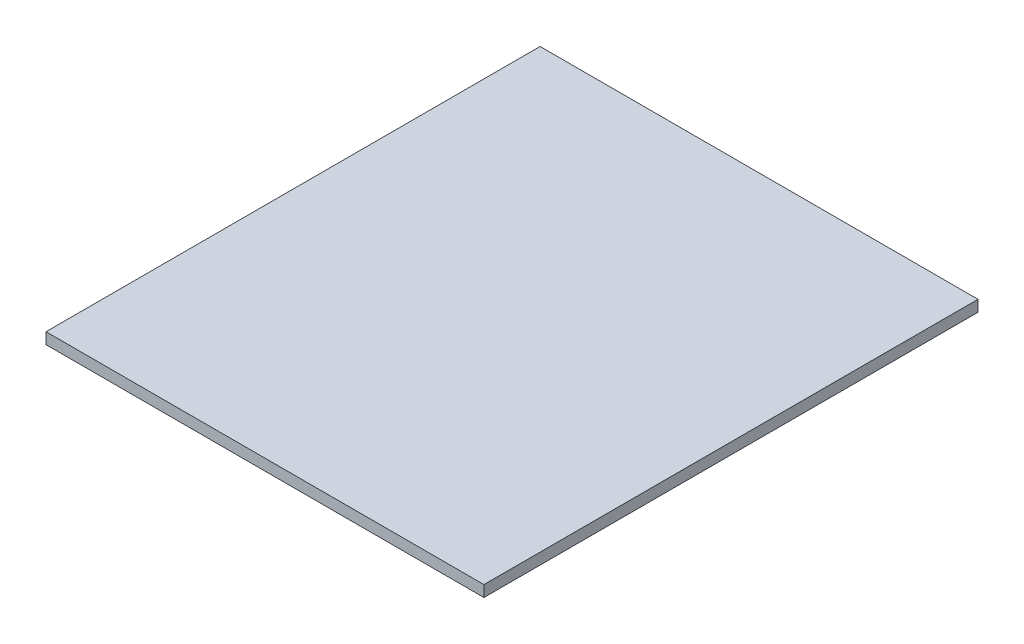
ISO-10303-21;
HEADER;
FILE_DESCRIPTION(('STEP AP214'),'2;1');
FILE_NAME('part.step','',(''),(''),'','','');
FILE_SCHEMA(('AUTOMOTIVE_DESIGN { 1 0 10303 214 1 1 1 1 }'));
ENDSEC;
DATA;
#1=APPLICATION_CONTEXT('core data for automotive mechanical design processes');
#2=APPLICATION_PROTOCOL_DEFINITION('international standard','automotive_design',2000,#1);
#3=PRODUCT_CONTEXT('',#1,'mechanical');
#4=PRODUCT('Part','Part','',(#3));
#5=PRODUCT_RELATED_PRODUCT_CATEGORY('part','',(#4));
#6=PRODUCT_DEFINITION_FORMATION('','',#4);
#7=PRODUCT_DEFINITION_CONTEXT('part definition',#1,'design');
#8=PRODUCT_DEFINITION('design','',#6,#7);
#9=PRODUCT_DEFINITION_SHAPE('','',#8);
#10=(LENGTH_UNIT() NAMED_UNIT(*) SI_UNIT(.MILLI.,.METRE.));
#11=(NAMED_UNIT(*) PLANE_ANGLE_UNIT() SI_UNIT($,.RADIAN.));
#12=(NAMED_UNIT(*) SI_UNIT($,.STERADIAN.) SOLID_ANGLE_UNIT());
#13=UNCERTAINTY_MEASURE_WITH_UNIT(LENGTH_MEASURE(1.E-05),#10,'distance_accuracy_value','');
#14=(GEOMETRIC_REPRESENTATION_CONTEXT(3) GLOBAL_UNCERTAINTY_ASSIGNED_CONTEXT((#13)) GLOBAL_UNIT_ASSIGNED_CONTEXT((#10,
#11,#12)) REPRESENTATION_CONTEXT('',''));
#15=CARTESIAN_POINT('',(0.,0.,0.));
#16=DIRECTION('',(0.,0.,1.));
#17=DIRECTION('',(1.,0.,0.));
#18=AXIS2_PLACEMENT_3D('',#15,#16,#17);
#19=CARTESIAN_POINT('',(0.,2.,0.));
#20=DIRECTION('',(1.,0.,0.));
#21=DIRECTION('',(0.,0.,-1.));
#22=AXIS2_PLACEMENT_3D('',#19,#20,#21);
#23=PLANE('',#22);
#24=DIRECTION('',(0.,0.,1.));
#25=VECTOR('',#24,1.);
#26=CARTESIAN_POINT('',(0.,0.,0.));
#27=LINE('',#26,#25);
#28=CARTESIAN_POINT('',(0.,0.,-88.));
#29=VERTEX_POINT('',#28);
#30=CARTESIAN_POINT('',(0.,0.,0.));
#31=VERTEX_POINT('',#30);
#32=EDGE_CURVE('E102',#29,#31,#27,.T.);
#33=ORIENTED_EDGE('',*,*,#32,.T.);
#34=DIRECTION('',(0.,-1.,0.));
#35=VECTOR('',#34,1.);
#36=CARTESIAN_POINT('',(0.,2.,0.));
#37=LINE('',#36,#35);
#38=CARTESIAN_POINT('',(0.,2.,0.));
#39=VERTEX_POINT('',#38);
#40=EDGE_CURVE('E11',#39,#31,#37,.T.);
#41=ORIENTED_EDGE('',*,*,#40,.F.);
#42=DIRECTION('',(0.,0.,1.));
#43=VECTOR('',#42,1.);
#44=CARTESIAN_POINT('',(0.,2.,0.));
#45=LINE('',#44,#43);
#46=CARTESIAN_POINT('',(0.,2.,-88.));
#47=VERTEX_POINT('',#46);
#48=EDGE_CURVE('E90',#47,#39,#45,.T.);
#49=ORIENTED_EDGE('',*,*,#48,.F.);
#50=DIRECTION('',(0.,-1.,0.));
#51=VECTOR('',#50,1.);
#52=CARTESIAN_POINT('',(0.,2.,-88.));
#53=LINE('',#52,#51);
#54=EDGE_CURVE('E98',#47,#29,#53,.T.);
#55=ORIENTED_EDGE('',*,*,#54,.T.);
#56=EDGE_LOOP('',(#33,#41,#49,#55));
#57=FACE_BOUND('',#56,.T.);
#58=ADVANCED_FACE('F39',(#57),#23,.F.);
#59=CARTESIAN_POINT('',(0.,2.,0.));
#60=DIRECTION('',(0.,0.,-1.));
#61=DIRECTION('',(-1.,0.,0.));
#62=AXIS2_PLACEMENT_3D('',#59,#60,#61);
#63=PLANE('',#62);
#64=DIRECTION('',(1.,0.,0.));
#65=VECTOR('',#64,1.);
#66=CARTESIAN_POINT('',(0.,0.,0.));
#67=LINE('',#66,#65);
#68=CARTESIAN_POINT('',(78.,0.,0.));
#69=VERTEX_POINT('',#68);
#70=EDGE_CURVE('E94',#31,#69,#67,.T.);
#71=ORIENTED_EDGE('',*,*,#70,.T.);
#72=DIRECTION('',(0.,-1.,0.));
#73=VECTOR('',#72,1.);
#74=CARTESIAN_POINT('',(78.,2.,0.));
#75=LINE('',#74,#73);
#76=CARTESIAN_POINT('',(78.,2.,0.));
#77=VERTEX_POINT('',#76);
#78=EDGE_CURVE('E47',#77,#69,#75,.T.);
#79=ORIENTED_EDGE('',*,*,#78,.F.);
#80=DIRECTION('',(1.,0.,0.));
#81=VECTOR('',#80,1.);
#82=CARTESIAN_POINT('',(0.,2.,0.));
#83=LINE('',#82,#81);
#84=EDGE_CURVE('E85',#39,#77,#83,.T.);
#85=ORIENTED_EDGE('',*,*,#84,.F.);
#86=ORIENTED_EDGE('',*,*,#40,.T.);
#87=EDGE_LOOP('',(#71,#79,#85,#86));
#88=FACE_BOUND('',#87,.T.);
#89=ADVANCED_FACE('F93',(#88),#63,.F.);
#90=CARTESIAN_POINT('',(78.,2.,0.));
#91=DIRECTION('',(-1.,0.,0.));
#92=DIRECTION('',(0.,0.,1.));
#93=AXIS2_PLACEMENT_3D('',#90,#91,#92);
#94=PLANE('',#93);
#95=DIRECTION('',(0.,0.,-1.));
#96=VECTOR('',#95,1.);
#97=CARTESIAN_POINT('',(78.,0.,0.));
#98=LINE('',#97,#96);
#99=CARTESIAN_POINT('',(78.,0.,-88.));
#100=VERTEX_POINT('',#99);
#101=EDGE_CURVE('E72',#69,#100,#98,.T.);
#102=ORIENTED_EDGE('',*,*,#101,.T.);
#103=DIRECTION('',(0.,-1.,0.));
#104=VECTOR('',#103,1.);
#105=CARTESIAN_POINT('',(78.,2.,-88.));
#106=LINE('',#105,#104);
#107=CARTESIAN_POINT('',(78.,2.,-88.));
#108=VERTEX_POINT('',#107);
#109=EDGE_CURVE('E95',#108,#100,#106,.T.);
#110=ORIENTED_EDGE('',*,*,#109,.F.);
#111=DIRECTION('',(0.,0.,-1.));
#112=VECTOR('',#111,1.);
#113=CARTESIAN_POINT('',(78.,2.,0.));
#114=LINE('',#113,#112);
#115=EDGE_CURVE('E88',#77,#108,#114,.T.);
#116=ORIENTED_EDGE('',*,*,#115,.F.);
#117=ORIENTED_EDGE('',*,*,#78,.T.);
#118=EDGE_LOOP('',(#102,#110,#116,#117));
#119=FACE_BOUND('',#118,.T.);
#120=ADVANCED_FACE('F96',(#119),#94,.F.);
#121=CARTESIAN_POINT('',(0.,2.,-88.));
#122=DIRECTION('',(0.,0.,1.));
#123=DIRECTION('',(1.,0.,0.));
#124=AXIS2_PLACEMENT_3D('',#121,#122,#123);
#125=PLANE('',#124);
#126=DIRECTION('',(-1.,0.,0.));
#127=VECTOR('',#126,1.);
#128=CARTESIAN_POINT('',(0.,0.,-88.));
#129=LINE('',#128,#127);
#130=EDGE_CURVE('E78',#100,#29,#129,.T.);
#131=ORIENTED_EDGE('',*,*,#130,.T.);
#132=ORIENTED_EDGE('',*,*,#54,.F.);
#133=DIRECTION('',(-1.,0.,0.));
#134=VECTOR('',#133,1.);
#135=CARTESIAN_POINT('',(0.,2.,-88.));
#136=LINE('',#135,#134);
#137=EDGE_CURVE('E55',#108,#47,#136,.T.);
#138=ORIENTED_EDGE('',*,*,#137,.F.);
#139=ORIENTED_EDGE('',*,*,#109,.T.);
#140=EDGE_LOOP('',(#131,#132,#138,#139));
#141=FACE_BOUND('',#140,.T.);
#142=ADVANCED_FACE('F109',(#141),#125,.F.);
#143=CARTESIAN_POINT('',(0.,2.,0.));
#144=DIRECTION('',(0.,-1.,0.));
#145=DIRECTION('',(0.,0.,-1.));
#146=AXIS2_PLACEMENT_3D('',#143,#144,#145);
#147=PLANE('',#146);
#148=ORIENTED_EDGE('',*,*,#48,.T.);
#149=ORIENTED_EDGE('',*,*,#84,.T.);
#150=ORIENTED_EDGE('',*,*,#115,.T.);
#151=ORIENTED_EDGE('',*,*,#137,.T.);
#152=EDGE_LOOP('',(#148,#149,#150,#151));
#153=FACE_BOUND('',#152,.T.);
#154=ADVANCED_FACE('F86',(#153),#147,.F.);
#155=CARTESIAN_POINT('',(0.,0.,0.));
#156=DIRECTION('',(0.,-1.,0.));
#157=DIRECTION('',(0.,0.,-1.));
#158=AXIS2_PLACEMENT_3D('',#155,#156,#157);
#159=PLANE('',#158);
#160=ORIENTED_EDGE('',*,*,#32,.F.);
#161=ORIENTED_EDGE('',*,*,#130,.F.);
#162=ORIENTED_EDGE('',*,*,#101,.F.);
#163=ORIENTED_EDGE('',*,*,#70,.F.);
#164=EDGE_LOOP('',(#160,#161,#162,#163));
#165=FACE_BOUND('',#164,.T.);
#166=ADVANCED_FACE('F112',(#165),#159,.T.);
#167=CLOSED_SHELL('',(#58,#89,#120,#142,#154,#166));
#168=MANIFOLD_SOLID_BREP('B2',#167);
#169=ADVANCED_BREP_SHAPE_REPRESENTATION('',(#18,#168),#14);
#170=SHAPE_DEFINITION_REPRESENTATION(#9,#169);
ENDSEC;
END-ISO-10303-21;
